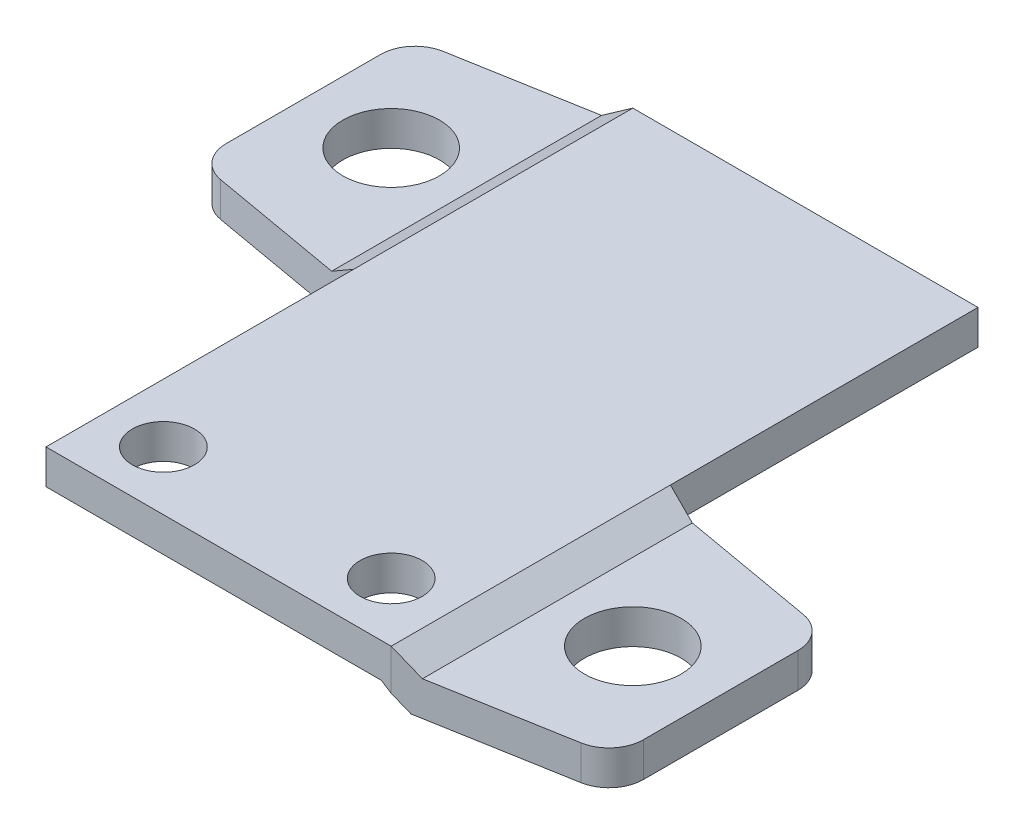
ISO-10303-21;
HEADER;
FILE_DESCRIPTION(('STEP AP214'),'2;1');
FILE_NAME('part.step','',(''),(''),'','','');
FILE_SCHEMA(('AUTOMOTIVE_DESIGN { 1 0 10303 214 1 1 1 1 }'));
ENDSEC;
DATA;
#1=APPLICATION_CONTEXT('core data for automotive mechanical design processes');
#2=APPLICATION_PROTOCOL_DEFINITION('international standard','automotive_design',2000,#1);
#3=PRODUCT_CONTEXT('',#1,'mechanical');
#4=PRODUCT('Part','Part','',(#3));
#5=PRODUCT_RELATED_PRODUCT_CATEGORY('part','',(#4));
#6=PRODUCT_DEFINITION_FORMATION('','',#4);
#7=PRODUCT_DEFINITION_CONTEXT('part definition',#1,'design');
#8=PRODUCT_DEFINITION('design','',#6,#7);
#9=PRODUCT_DEFINITION_SHAPE('','',#8);
#10=(LENGTH_UNIT() NAMED_UNIT(*) SI_UNIT(.MILLI.,.METRE.));
#11=(NAMED_UNIT(*) PLANE_ANGLE_UNIT() SI_UNIT($,.RADIAN.));
#12=(NAMED_UNIT(*) SI_UNIT($,.STERADIAN.) SOLID_ANGLE_UNIT());
#13=UNCERTAINTY_MEASURE_WITH_UNIT(LENGTH_MEASURE(1.E-05),#10,'distance_accuracy_value','');
#14=(GEOMETRIC_REPRESENTATION_CONTEXT(3) GLOBAL_UNCERTAINTY_ASSIGNED_CONTEXT((#13)) GLOBAL_UNIT_ASSIGNED_CONTEXT((#10,
#11,#12)) REPRESENTATION_CONTEXT('',''));
#15=CARTESIAN_POINT('',(0.,0.,0.));
#16=DIRECTION('',(0.,0.,1.));
#17=DIRECTION('',(1.,0.,0.));
#18=AXIS2_PLACEMENT_3D('',#15,#16,#17);
#19=CARTESIAN_POINT('',(-5.76993248190729,-0.5,8.5));
#20=DIRECTION('',(0.544639035015029,-0.838670567945423,0.));
#21=DIRECTION('',(0.838670567945423,0.544639035015029,0.));
#22=AXIS2_PLACEMENT_3D('',#19,#20,#21);
#23=PLANE('',#22);
#24=DIRECTION('',(0.,0.,-1.));
#25=VECTOR('',#24,1.);
#26=CARTESIAN_POINT('',(-5.76993248190729,-0.5,8.5));
#27=LINE('',#26,#25);
#28=CARTESIAN_POINT('',(-5.76993248190729,-0.5,-0.545961475987513));
#29=VERTEX_POINT('',#28);
#30=CARTESIAN_POINT('',(-5.76993248190729,-0.5,-8.36424013011591));
#31=VERTEX_POINT('',#30);
#32=EDGE_CURVE('E218',#29,#31,#27,.T.);
#33=ORIENTED_EDGE('',*,*,#32,.F.);
#34=DIRECTION('',(0.829648021602656,0.53877972491006,0.146289330699951));
#35=VECTOR('',#34,1.);
#36=CARTESIAN_POINT('',(-4.67203631526905,0.212982107157314,-0.352372759792788));
#37=LINE('',#36,#35);
#38=CARTESIAN_POINT('',(-5.,0.,-0.410201606103421));
#39=VERTEX_POINT('',#38);
#40=EDGE_CURVE('E287',#29,#39,#37,.T.);
#41=ORIENTED_EDGE('',*,*,#40,.T.);
#42=DIRECTION('',(0.,0.,-1.));
#43=VECTOR('',#42,1.);
#44=CARTESIAN_POINT('',(-5.,0.,8.5));
#45=LINE('',#44,#43);
#46=CARTESIAN_POINT('',(-5.,0.,-8.5));
#47=VERTEX_POINT('',#46);
#48=EDGE_CURVE('E348',#39,#47,#45,.T.);
#49=ORIENTED_EDGE('',*,*,#48,.T.);
#50=DIRECTION('',(-0.829648021602656,-0.53877972491006,0.146289330699951));
#51=VECTOR('',#50,1.);
#52=CARTESIAN_POINT('',(-7.81672260380528,-1.82920104684222,-8.00333580777771));
#53=LINE('',#52,#51);
#54=EDGE_CURVE('E301',#47,#31,#53,.T.);
#55=ORIENTED_EDGE('',*,*,#54,.T.);
#56=EDGE_LOOP('',(#33,#41,#49,#55));
#57=FACE_BOUND('',#56,.T.);
#58=ADVANCED_FACE('F40',(#57),#23,.F.);
#59=CARTESIAN_POINT('',(-10.5,-0.5,8.5));
#60=DIRECTION('',(0.,-1.,0.));
#61=DIRECTION('',(0.,0.,-1.));
#62=AXIS2_PLACEMENT_3D('',#59,#60,#61);
#63=PLANE('',#62);
#64=CARTESIAN_POINT('',(-8.,-0.5,-4.5));
#65=DIRECTION('',(0.,-1.,0.));
#66=DIRECTION('',(0.,0.,-1.));
#67=AXIS2_PLACEMENT_3D('',#64,#65,#66);
#68=CIRCLE('',#67,1.4);
#69=CARTESIAN_POINT('',(-8.,-0.5,-5.9));
#70=VERTEX_POINT('',#69);
#71=EDGE_CURVE('E326',#70,#70,#68,.T.);
#72=ORIENTED_EDGE('',*,*,#71,.T.);
#73=EDGE_LOOP('',(#72));
#74=FACE_BOUND('',#73,.T.);
#75=DIRECTION('',(0.,0.,-1.));
#76=VECTOR('',#75,1.);
#77=CARTESIAN_POINT('',(-10.5,-0.5,8.5));
#78=LINE('',#77,#76);
#79=CARTESIAN_POINT('',(-10.5,-0.5,-2.21909963117728));
#80=VERTEX_POINT('',#79);
#81=CARTESIAN_POINT('',(-10.5,-0.5,-6.69110197492614));
#82=VERTEX_POINT('',#81);
#83=EDGE_CURVE('E216',#80,#82,#78,.T.);
#84=ORIENTED_EDGE('',*,*,#83,.F.);
#85=CARTESIAN_POINT('',(-9.5,-0.5,-2.21909963117728));
#86=DIRECTION('',(0.,-1.,0.));
#87=DIRECTION('',(0.,0.,-1.));
#88=AXIS2_PLACEMENT_3D('',#85,#86,#87);
#89=CIRCLE('',#88,1.);
#90=CARTESIAN_POINT('',(-9.67364817766694,-0.5,-1.23429187816507));
#91=VERTEX_POINT('',#90);
#92=EDGE_CURVE('E270',#80,#91,#89,.F.);
#93=ORIENTED_EDGE('',*,*,#92,.T.);
#94=DIRECTION('',(0.984807753012207,0.,0.173648177666934));
#95=VECTOR('',#94,1.);
#96=CARTESIAN_POINT('',(-8.81042049197116,-0.5,-1.08208154668238));
#97=LINE('',#96,#95);
#98=EDGE_CURVE('E283',#91,#29,#97,.T.);
#99=ORIENTED_EDGE('',*,*,#98,.T.);
#100=ORIENTED_EDGE('',*,*,#32,.T.);
#101=DIRECTION('',(-0.984807753012207,0.,0.173648177666935));
#102=VECTOR('',#101,1.);
#103=CARTESIAN_POINT('',(-13.2413259254295,-0.5,-7.04683188253458));
#104=LINE('',#103,#102);
#105=CARTESIAN_POINT('',(-9.67364817766694,-0.5,-7.67590972793835));
#106=VERTEX_POINT('',#105);
#107=EDGE_CURVE('E302',#31,#106,#104,.T.);
#108=ORIENTED_EDGE('',*,*,#107,.T.);
#109=CARTESIAN_POINT('',(-9.5,-0.5,-6.69110197492614));
#110=DIRECTION('',(0.,-1.,0.));
#111=DIRECTION('',(0.,0.,-1.));
#112=AXIS2_PLACEMENT_3D('',#109,#110,#111);
#113=CIRCLE('',#112,1.);
#114=EDGE_CURVE('E264',#106,#82,#113,.F.);
#115=ORIENTED_EDGE('',*,*,#114,.T.);
#116=EDGE_LOOP('',(#84,#93,#99,#100,#108,#115));
#117=FACE_BOUND('',#116,.T.);
#118=ADVANCED_FACE('F284',(#74,#117),#63,.F.);
#119=CARTESIAN_POINT('',(-10.5,-1.5,8.5));
#120=DIRECTION('',(1.,0.,0.));
#121=DIRECTION('',(0.,0.,-1.));
#122=AXIS2_PLACEMENT_3D('',#119,#120,#121);
#123=PLANE('',#122);
#124=DIRECTION('',(0.,0.,-1.));
#125=VECTOR('',#124,1.);
#126=CARTESIAN_POINT('',(-10.5,-1.5,8.5));
#127=LINE('',#126,#125);
#128=CARTESIAN_POINT('',(-10.5,-1.5,-2.21909963117728));
#129=VERTEX_POINT('',#128);
#130=CARTESIAN_POINT('',(-10.5,-1.5,-6.69110197492614));
#131=VERTEX_POINT('',#130);
#132=EDGE_CURVE('E212',#129,#131,#127,.T.);
#133=ORIENTED_EDGE('',*,*,#132,.F.);
#134=DIRECTION('',(0.,1.,0.));
#135=VECTOR('',#134,1.);
#136=CARTESIAN_POINT('',(-10.5,-1.5,-2.21909963117728));
#137=LINE('',#136,#135);
#138=EDGE_CURVE('E265',#129,#80,#137,.T.);
#139=ORIENTED_EDGE('',*,*,#138,.T.);
#140=ORIENTED_EDGE('',*,*,#83,.T.);
#141=DIRECTION('',(0.,1.,0.));
#142=VECTOR('',#141,1.);
#143=CARTESIAN_POINT('',(-10.5,-1.5,-6.69110197492614));
#144=LINE('',#143,#142);
#145=EDGE_CURVE('E257',#82,#131,#144,.F.);
#146=ORIENTED_EDGE('',*,*,#145,.T.);
#147=EDGE_LOOP('',(#133,#139,#140,#146));
#148=FACE_BOUND('',#147,.T.);
#149=ADVANCED_FACE('F279',(#148),#123,.F.);
#150=CARTESIAN_POINT('',(-5.487,-1.5,8.5));
#151=DIRECTION('',(0.,1.,0.));
#152=DIRECTION('',(-1.,0.,0.));
#153=AXIS2_PLACEMENT_3D('',#150,#151,#152);
#154=PLANE('',#153);
#155=CARTESIAN_POINT('',(-8.,-1.5,-4.5));
#156=DIRECTION('',(0.,1.,0.));
#157=DIRECTION('',(0.,0.,1.));
#158=AXIS2_PLACEMENT_3D('',#155,#156,#157);
#159=CIRCLE('',#158,1.4);
#160=CARTESIAN_POINT('',(-8.,-1.5,-3.1));
#161=VERTEX_POINT('',#160);
#162=EDGE_CURVE('E323',#161,#161,#159,.T.);
#163=ORIENTED_EDGE('',*,*,#162,.T.);
#164=EDGE_LOOP('',(#163));
#165=FACE_BOUND('',#164,.T.);
#166=DIRECTION('',(-0.984807753012207,0.,-0.173648177666934));
#167=VECTOR('',#166,1.);
#168=CARTESIAN_POINT('',(-10.5,-1.5,-1.38));
#169=LINE('',#168,#167);
#170=CARTESIAN_POINT('',(-5.487,-1.5,-0.496072845708446));
#171=VERTEX_POINT('',#170);
#172=CARTESIAN_POINT('',(-9.67364817766694,-1.5,-1.23429187816507));
#173=VERTEX_POINT('',#172);
#174=EDGE_CURVE('E273',#171,#173,#169,.T.);
#175=ORIENTED_EDGE('',*,*,#174,.T.);
#176=CARTESIAN_POINT('',(-9.5,-1.5,-2.21909963117728));
#177=DIRECTION('',(0.,1.,0.));
#178=DIRECTION('',(-1.,0.,0.));
#179=AXIS2_PLACEMENT_3D('',#176,#177,#178);
#180=CIRCLE('',#179,1.);
#181=EDGE_CURVE('E44',#173,#129,#180,.F.);
#182=ORIENTED_EDGE('',*,*,#181,.T.);
#183=ORIENTED_EDGE('',*,*,#132,.T.);
#184=CARTESIAN_POINT('',(-9.5,-1.5,-6.69110197492614));
#185=DIRECTION('',(0.,1.,0.));
#186=DIRECTION('',(-1.,0.,0.));
#187=AXIS2_PLACEMENT_3D('',#184,#185,#186);
#188=CIRCLE('',#187,1.);
#189=CARTESIAN_POINT('',(-9.67364817766694,-1.5,-7.67590972793835));
#190=VERTEX_POINT('',#189);
#191=EDGE_CURVE('E55',#131,#190,#188,.F.);
#192=ORIENTED_EDGE('',*,*,#191,.T.);
#193=DIRECTION('',(0.984807753012207,0.,-0.173648177666935));
#194=VECTOR('',#193,1.);
#195=CARTESIAN_POINT('',(-5.,-1.5,-8.5));
#196=LINE('',#195,#194);
#197=CARTESIAN_POINT('',(-5.487,-1.5,-8.41412876039498));
#198=VERTEX_POINT('',#197);
#199=EDGE_CURVE('E295',#190,#198,#196,.T.);
#200=ORIENTED_EDGE('',*,*,#199,.T.);
#201=DIRECTION('',(0.,0.,-1.));
#202=VECTOR('',#201,1.);
#203=CARTESIAN_POINT('',(-5.487,-1.5,8.5));
#204=LINE('',#203,#202);
#205=EDGE_CURVE('E206',#171,#198,#204,.T.);
#206=ORIENTED_EDGE('',*,*,#205,.F.);
#207=EDGE_LOOP('',(#175,#182,#183,#192,#200,#206));
#208=FACE_BOUND('',#207,.T.);
#209=ADVANCED_FACE('F275',(#165,#208),#154,.F.);
#210=CARTESIAN_POINT('',(-4.71706751809271,-1.,8.5));
#211=DIRECTION('',(-0.544639035015029,0.838670567945423,0.));
#212=DIRECTION('',(-0.838670567945423,-0.544639035015029,0.));
#213=AXIS2_PLACEMENT_3D('',#210,#211,#212);
#214=PLANE('',#213);
#215=DIRECTION('',(0.,0.,-1.));
#216=VECTOR('',#215,1.);
#217=CARTESIAN_POINT('',(-4.71706751809271,-1.,8.5));
#218=LINE('',#217,#216);
#219=CARTESIAN_POINT('',(-4.71706751809271,-1.,-0.360312975824356));
#220=VERTEX_POINT('',#219);
#221=CARTESIAN_POINT('',(-4.71706751809271,-1.,-8.5));
#222=VERTEX_POINT('',#221);
#223=EDGE_CURVE('E201',#220,#222,#218,.T.);
#224=ORIENTED_EDGE('',*,*,#223,.F.);
#225=DIRECTION('',(-0.829648021602656,-0.53877972491006,-0.146289330699951));
#226=VECTOR('',#225,1.);
#227=CARTESIAN_POINT('',(-3.64170325999867,-0.30165028534052,-0.170697243032831));
#228=LINE('',#227,#226);
#229=EDGE_CURVE('E239',#220,#171,#228,.T.);
#230=ORIENTED_EDGE('',*,*,#229,.T.);
#231=ORIENTED_EDGE('',*,*,#205,.T.);
#232=DIRECTION('',(0.829648021602656,0.53877972491006,-0.146289330699951));
#233=VECTOR('',#232,1.);
#234=CARTESIAN_POINT('',(-6.7863895485349,-2.34383343934006,-8.18501132453767));
#235=LINE('',#234,#233);
#236=CARTESIAN_POINT('',(-5.,-1.18373850211281,-8.5));
#237=VERTEX_POINT('',#236);
#238=EDGE_CURVE('E297',#198,#237,#235,.T.);
#239=ORIENTED_EDGE('',*,*,#238,.T.);
#240=DIRECTION('',(0.838670567945423,0.544639035015029,0.));
#241=VECTOR('',#240,1.);
#242=CARTESIAN_POINT('',(-4.71706751809271,-1.,-8.5));
#243=LINE('',#242,#241);
#244=EDGE_CURVE('E345',#237,#222,#243,.T.);
#245=ORIENTED_EDGE('',*,*,#244,.T.);
#246=EDGE_LOOP('',(#224,#230,#231,#239,#245));
#247=FACE_BOUND('',#246,.T.);
#248=ADVANCED_FACE('F522',(#247),#214,.F.);
#249=CARTESIAN_POINT('',(4.71706751809271,-1.,8.5));
#250=DIRECTION('',(0.,1.,0.));
#251=DIRECTION('',(0.,0.,1.));
#252=AXIS2_PLACEMENT_3D('',#249,#250,#251);
#253=PLANE('',#252);
#254=CARTESIAN_POINT('',(3.3,-1.,6.8));
#255=DIRECTION('',(0.,1.,0.));
#256=DIRECTION('',(0.,0.,1.));
#257=AXIS2_PLACEMENT_3D('',#254,#255,#256);
#258=CIRCLE('',#257,0.899999999999999);
#259=CARTESIAN_POINT('',(3.3,-1.,7.7));
#260=VERTEX_POINT('',#259);
#261=EDGE_CURVE('E334',#260,#260,#258,.T.);
#262=ORIENTED_EDGE('',*,*,#261,.T.);
#263=EDGE_LOOP('',(#262));
#264=FACE_BOUND('',#263,.T.);
#265=CARTESIAN_POINT('',(-3.3,-1.,6.8));
#266=DIRECTION('',(0.,1.,0.));
#267=DIRECTION('',(0.,0.,1.));
#268=AXIS2_PLACEMENT_3D('',#265,#266,#267);
#269=CIRCLE('',#268,0.9);
#270=CARTESIAN_POINT('',(-3.3,-1.,7.7));
#271=VERTEX_POINT('',#270);
#272=EDGE_CURVE('E338',#271,#271,#269,.T.);
#273=ORIENTED_EDGE('',*,*,#272,.T.);
#274=EDGE_LOOP('',(#273));
#275=FACE_BOUND('',#274,.T.);
#276=DIRECTION('',(1.,0.,0.));
#277=VECTOR('',#276,1.);
#278=CARTESIAN_POINT('',(4.71706751809271,-1.,-8.5));
#279=LINE('',#278,#277);
#280=CARTESIAN_POINT('',(5.,-1.,-8.5));
#281=VERTEX_POINT('',#280);
#282=EDGE_CURVE('E352',#222,#281,#279,.T.);
#283=ORIENTED_EDGE('',*,*,#282,.T.);
#284=DIRECTION('',(0.,0.,-1.));
#285=VECTOR('',#284,1.);
#286=CARTESIAN_POINT('',(5.,-1.,0.72521774456594));
#287=LINE('',#286,#285);
#288=CARTESIAN_POINT('',(5.,-1.,0.410201606103422));
#289=VERTEX_POINT('',#288);
#290=EDGE_CURVE('E197',#289,#281,#287,.T.);
#291=ORIENTED_EDGE('',*,*,#290,.F.);
#292=DIRECTION('',(0.984807753012207,0.,0.173648177666934));
#293=VECTOR('',#292,1.);
#294=CARTESIAN_POINT('',(4.77946990874532,-1.,0.371316200957121));
#295=LINE('',#294,#293);
#296=CARTESIAN_POINT('',(4.71706751809271,-1.,0.360312975824356));
#297=VERTEX_POINT('',#296);
#298=EDGE_CURVE('E179',#297,#289,#295,.T.);
#299=ORIENTED_EDGE('',*,*,#298,.F.);
#300=DIRECTION('',(0.,0.,-1.));
#301=VECTOR('',#300,1.);
#302=CARTESIAN_POINT('',(4.71706751809271,-1.,8.5));
#303=LINE('',#302,#301);
#304=CARTESIAN_POINT('',(4.71706751809271,-1.,8.5));
#305=VERTEX_POINT('',#304);
#306=EDGE_CURVE('E191',#305,#297,#303,.T.);
#307=ORIENTED_EDGE('',*,*,#306,.F.);
#308=DIRECTION('',(1.,0.,0.));
#309=VECTOR('',#308,1.);
#310=CARTESIAN_POINT('',(4.71706751809271,-1.,8.5));
#311=LINE('',#310,#309);
#312=CARTESIAN_POINT('',(-5.,-1.,8.5));
#313=VERTEX_POINT('',#312);
#314=EDGE_CURVE('E342',#313,#305,#311,.T.);
#315=ORIENTED_EDGE('',*,*,#314,.F.);
#316=DIRECTION('',(0.,0.,1.));
#317=VECTOR('',#316,1.);
#318=CARTESIAN_POINT('',(-5.,-1.,-0.725217744565933));
#319=LINE('',#318,#317);
#320=CARTESIAN_POINT('',(-5.,-1.,-0.410201606103421));
#321=VERTEX_POINT('',#320);
#322=EDGE_CURVE('E399',#321,#313,#319,.T.);
#323=ORIENTED_EDGE('',*,*,#322,.F.);
#324=DIRECTION('',(-0.984807753012207,0.,-0.173648177666934));
#325=VECTOR('',#324,1.);
#326=CARTESIAN_POINT('',(-4.77946990874532,-1.,-0.371316200957121));
#327=LINE('',#326,#325);
#328=EDGE_CURVE('E403',#220,#321,#327,.T.);
#329=ORIENTED_EDGE('',*,*,#328,.F.);
#330=ORIENTED_EDGE('',*,*,#223,.T.);
#331=EDGE_LOOP('',(#283,#291,#299,#307,#315,#323,#329,#330));
#332=FACE_BOUND('',#331,.T.);
#333=ADVANCED_FACE('F195',(#264,#275,#332),#253,.F.);
#334=CARTESIAN_POINT('',(5.487,-1.5,8.5));
#335=DIRECTION('',(0.544639035015029,0.838670567945423,0.));
#336=DIRECTION('',(-0.838670567945423,0.544639035015029,0.));
#337=AXIS2_PLACEMENT_3D('',#334,#335,#336);
#338=PLANE('',#337);
#339=ORIENTED_EDGE('',*,*,#306,.T.);
#340=DIRECTION('',(0.829648021602656,-0.538779724910059,0.146289330699951));
#341=VECTOR('',#340,1.);
#342=CARTESIAN_POINT('',(6.45842586380395,-2.13085133218274,0.667361435255113));
#343=LINE('',#342,#341);
#344=CARTESIAN_POINT('',(5.487,-1.5,0.496072845708446));
#345=VERTEX_POINT('',#344);
#346=EDGE_CURVE('E176',#297,#345,#343,.T.);
#347=ORIENTED_EDGE('',*,*,#346,.T.);
#348=DIRECTION('',(0.,0.,-1.));
#349=VECTOR('',#348,1.);
#350=CARTESIAN_POINT('',(5.487,-1.5,8.5));
#351=LINE('',#350,#349);
#352=CARTESIAN_POINT('',(5.487,-1.5,8.41412876039498));
#353=VERTEX_POINT('',#352);
#354=EDGE_CURVE('E204',#353,#345,#351,.T.);
#355=ORIENTED_EDGE('',*,*,#354,.F.);
#356=DIRECTION('',(-0.829648021602656,0.538779724910059,0.146289330699952));
#357=VECTOR('',#356,1.);
#358=CARTESIAN_POINT('',(5.47657792324928,-1.49323182422119,8.41596645372114));
#359=LINE('',#358,#357);
#360=CARTESIAN_POINT('',(5.,-1.18373850211281,8.5));
#361=VERTEX_POINT('',#360);
#362=EDGE_CURVE('E321',#353,#361,#359,.T.);
#363=ORIENTED_EDGE('',*,*,#362,.T.);
#364=DIRECTION('',(0.838670567945423,-0.544639035015029,0.));
#365=VECTOR('',#364,1.);
#366=CARTESIAN_POINT('',(5.487,-1.5,8.5));
#367=LINE('',#366,#365);
#368=EDGE_CURVE('E205',#305,#361,#367,.T.);
#369=ORIENTED_EDGE('',*,*,#368,.F.);
#370=EDGE_LOOP('',(#339,#347,#355,#363,#369));
#371=FACE_BOUND('',#370,.T.);
#372=ADVANCED_FACE('F200',(#371),#338,.F.);
#373=CARTESIAN_POINT('',(10.5,-1.5,8.5));
#374=DIRECTION('',(0.,1.,0.));
#375=DIRECTION('',(-1.,0.,0.));
#376=AXIS2_PLACEMENT_3D('',#373,#374,#375);
#377=PLANE('',#376);
#378=CARTESIAN_POINT('',(8.,-1.5,4.5));
#379=DIRECTION('',(0.,1.,0.));
#380=DIRECTION('',(0.,0.,1.));
#381=AXIS2_PLACEMENT_3D('',#378,#379,#380);
#382=CIRCLE('',#381,1.4);
#383=CARTESIAN_POINT('',(8.,-1.5,5.9));
#384=VERTEX_POINT('',#383);
#385=EDGE_CURVE('E226',#384,#384,#382,.T.);
#386=ORIENTED_EDGE('',*,*,#385,.T.);
#387=EDGE_LOOP('',(#386));
#388=FACE_BOUND('',#387,.T.);
#389=DIRECTION('',(0.,0.,-1.));
#390=VECTOR('',#389,1.);
#391=CARTESIAN_POINT('',(10.5,-1.5,8.5));
#392=LINE('',#391,#390);
#393=CARTESIAN_POINT('',(10.5,-1.5,6.69110197492614));
#394=VERTEX_POINT('',#393);
#395=CARTESIAN_POINT('',(10.5,-1.5,2.21909963117728));
#396=VERTEX_POINT('',#395);
#397=EDGE_CURVE('E208',#394,#396,#392,.T.);
#398=ORIENTED_EDGE('',*,*,#397,.F.);
#399=CARTESIAN_POINT('',(9.5,-1.5,6.69110197492614));
#400=DIRECTION('',(0.,1.,0.));
#401=DIRECTION('',(-1.,0.,0.));
#402=AXIS2_PLACEMENT_3D('',#399,#400,#401);
#403=CIRCLE('',#402,1.);
#404=CARTESIAN_POINT('',(9.67364817766694,-1.5,7.67590972793835));
#405=VERTEX_POINT('',#404);
#406=EDGE_CURVE('E258',#394,#405,#403,.F.);
#407=ORIENTED_EDGE('',*,*,#406,.T.);
#408=DIRECTION('',(-0.984807753012207,0.,0.173648177666935));
#409=VECTOR('',#408,1.);
#410=CARTESIAN_POINT('',(5.,-1.5,8.5));
#411=LINE('',#410,#409);
#412=EDGE_CURVE('E187',#405,#353,#411,.T.);
#413=ORIENTED_EDGE('',*,*,#412,.T.);
#414=ORIENTED_EDGE('',*,*,#354,.T.);
#415=DIRECTION('',(0.984807753012207,0.,0.173648177666934));
#416=VECTOR('',#415,1.);
#417=CARTESIAN_POINT('',(10.5,-1.5,1.38));
#418=LINE('',#417,#416);
#419=CARTESIAN_POINT('',(9.67364817766694,-1.5,1.23429187816507));
#420=VERTEX_POINT('',#419);
#421=EDGE_CURVE('E181',#345,#420,#418,.T.);
#422=ORIENTED_EDGE('',*,*,#421,.T.);
#423=CARTESIAN_POINT('',(9.5,-1.5,2.21909963117728));
#424=DIRECTION('',(0.,1.,0.));
#425=DIRECTION('',(-1.,0.,0.));
#426=AXIS2_PLACEMENT_3D('',#423,#424,#425);
#427=CIRCLE('',#426,1.);
#428=EDGE_CURVE('E255',#420,#396,#427,.F.);
#429=ORIENTED_EDGE('',*,*,#428,.T.);
#430=EDGE_LOOP('',(#398,#407,#413,#414,#422,#429));
#431=FACE_BOUND('',#430,.T.);
#432=ADVANCED_FACE('F395',(#388,#431),#377,.F.);
#433=CARTESIAN_POINT('',(10.5,-0.5,8.5));
#434=DIRECTION('',(-1.,0.,0.));
#435=DIRECTION('',(0.,0.,1.));
#436=AXIS2_PLACEMENT_3D('',#433,#434,#435);
#437=PLANE('',#436);
#438=DIRECTION('',(0.,0.,-1.));
#439=VECTOR('',#438,1.);
#440=CARTESIAN_POINT('',(10.5,-0.5,8.5));
#441=LINE('',#440,#439);
#442=CARTESIAN_POINT('',(10.5,-0.5,6.69110197492614));
#443=VERTEX_POINT('',#442);
#444=CARTESIAN_POINT('',(10.5,-0.5,2.21909963117728));
#445=VERTEX_POINT('',#444);
#446=EDGE_CURVE('E368',#443,#445,#441,.T.);
#447=ORIENTED_EDGE('',*,*,#446,.F.);
#448=DIRECTION('',(0.,1.,0.));
#449=VECTOR('',#448,1.);
#450=CARTESIAN_POINT('',(10.5,-0.5,6.69110197492614));
#451=LINE('',#450,#449);
#452=EDGE_CURVE('E252',#443,#394,#451,.F.);
#453=ORIENTED_EDGE('',*,*,#452,.T.);
#454=ORIENTED_EDGE('',*,*,#397,.T.);
#455=DIRECTION('',(0.,1.,0.));
#456=VECTOR('',#455,1.);
#457=CARTESIAN_POINT('',(10.5,-0.5,2.21909963117728));
#458=LINE('',#457,#456);
#459=EDGE_CURVE('E246',#396,#445,#458,.T.);
#460=ORIENTED_EDGE('',*,*,#459,.T.);
#461=EDGE_LOOP('',(#447,#453,#454,#460));
#462=FACE_BOUND('',#461,.T.);
#463=ADVANCED_FACE('F373',(#462),#437,.F.);
#464=CARTESIAN_POINT('',(5.76993248190729,-0.5,8.5));
#465=DIRECTION('',(0.,-1.,0.));
#466=DIRECTION('',(0.,0.,-1.));
#467=AXIS2_PLACEMENT_3D('',#464,#465,#466);
#468=PLANE('',#467);
#469=CARTESIAN_POINT('',(8.,-0.5,4.5));
#470=DIRECTION('',(0.,-1.,0.));
#471=DIRECTION('',(0.,0.,-1.));
#472=AXIS2_PLACEMENT_3D('',#469,#470,#471);
#473=CIRCLE('',#472,1.4);
#474=CARTESIAN_POINT('',(8.,-0.5,3.1));
#475=VERTEX_POINT('',#474);
#476=EDGE_CURVE('E225',#475,#475,#473,.T.);
#477=ORIENTED_EDGE('',*,*,#476,.T.);
#478=EDGE_LOOP('',(#477));
#479=FACE_BOUND('',#478,.T.);
#480=DIRECTION('',(0.984807753012207,0.,-0.173648177666935));
#481=VECTOR('',#480,1.);
#482=CARTESIAN_POINT('',(5.74671617682947,-0.5,8.36833379109349));
#483=LINE('',#482,#481);
#484=CARTESIAN_POINT('',(5.76993248190729,-0.5,8.36424013011591));
#485=VERTEX_POINT('',#484);
#486=CARTESIAN_POINT('',(9.67364817766694,-0.5,7.67590972793835));
#487=VERTEX_POINT('',#486);
#488=EDGE_CURVE('E318',#485,#487,#483,.T.);
#489=ORIENTED_EDGE('',*,*,#488,.T.);
#490=CARTESIAN_POINT('',(9.5,-0.5,6.69110197492614));
#491=DIRECTION('',(0.,-1.,0.));
#492=DIRECTION('',(0.,0.,-1.));
#493=AXIS2_PLACEMENT_3D('',#490,#491,#492);
#494=CIRCLE('',#493,1.);
#495=EDGE_CURVE('E249',#487,#443,#494,.F.);
#496=ORIENTED_EDGE('',*,*,#495,.T.);
#497=ORIENTED_EDGE('',*,*,#446,.T.);
#498=CARTESIAN_POINT('',(9.5,-0.5,2.21909963117728));
#499=DIRECTION('',(0.,-1.,0.));
#500=DIRECTION('',(0.,0.,-1.));
#501=AXIS2_PLACEMENT_3D('',#498,#499,#500);
#502=CIRCLE('',#501,1.);
#503=CARTESIAN_POINT('',(9.67364817766694,-0.5,1.23429187816507));
#504=VERTEX_POINT('',#503);
#505=EDGE_CURVE('E244',#445,#504,#502,.F.);
#506=ORIENTED_EDGE('',*,*,#505,.T.);
#507=DIRECTION('',(-0.984807753012207,0.,-0.173648177666934));
#508=VECTOR('',#507,1.);
#509=CARTESIAN_POINT('',(7.13015317990764,-0.5,0.785805084763081));
#510=LINE('',#509,#508);
#511=CARTESIAN_POINT('',(5.76993248190729,-0.5,0.545961475987512));
#512=VERTEX_POINT('',#511);
#513=EDGE_CURVE('E188',#504,#512,#510,.T.);
#514=ORIENTED_EDGE('',*,*,#513,.T.);
#515=DIRECTION('',(0.,0.,-1.));
#516=VECTOR('',#515,1.);
#517=CARTESIAN_POINT('',(5.76993248190729,-0.5,8.5));
#518=LINE('',#517,#516);
#519=EDGE_CURVE('E361',#485,#512,#518,.T.);
#520=ORIENTED_EDGE('',*,*,#519,.F.);
#521=EDGE_LOOP('',(#489,#496,#497,#506,#514,#520));
#522=FACE_BOUND('',#521,.T.);
#523=ADVANCED_FACE('F385',(#479,#522),#468,.F.);
#524=CARTESIAN_POINT('',(5.,0.,8.5));
#525=DIRECTION('',(-0.544639035015029,-0.838670567945423,0.));
#526=DIRECTION('',(0.838670567945423,-0.544639035015029,0.));
#527=AXIS2_PLACEMENT_3D('',#524,#525,#526);
#528=PLANE('',#527);
#529=ORIENTED_EDGE('',*,*,#519,.T.);
#530=DIRECTION('',(-0.829648021602656,0.538779724910059,-0.146289330699951));
#531=VECTOR('',#530,1.);
#532=CARTESIAN_POINT('',(5.98184794055467,-0.637619507961543,0.583327888976255));
#533=LINE('',#532,#531);
#534=CARTESIAN_POINT('',(5.,0.,0.410201606103422));
#535=VERTEX_POINT('',#534);
#536=EDGE_CURVE('E231',#512,#535,#533,.T.);
#537=ORIENTED_EDGE('',*,*,#536,.T.);
#538=DIRECTION('',(0.,0.,-1.));
#539=VECTOR('',#538,1.);
#540=CARTESIAN_POINT('',(5.,0.,8.5));
#541=LINE('',#540,#539);
#542=CARTESIAN_POINT('',(5.,0.,8.5));
#543=VERTEX_POINT('',#542);
#544=EDGE_CURVE('E358',#543,#535,#541,.T.);
#545=ORIENTED_EDGE('',*,*,#544,.F.);
#546=DIRECTION('',(0.829648021602656,-0.538779724910059,-0.146289330699952));
#547=VECTOR('',#546,1.);
#548=CARTESIAN_POINT('',(5.,0.,8.5));
#549=LINE('',#548,#547);
#550=EDGE_CURVE('E312',#543,#485,#549,.T.);
#551=ORIENTED_EDGE('',*,*,#550,.T.);
#552=EDGE_LOOP('',(#529,#537,#545,#551));
#553=FACE_BOUND('',#552,.T.);
#554=ADVANCED_FACE('F390',(#553),#528,.F.);
#555=CARTESIAN_POINT('',(-5.,0.,8.5));
#556=DIRECTION('',(0.,-1.,0.));
#557=DIRECTION('',(0.,0.,-1.));
#558=AXIS2_PLACEMENT_3D('',#555,#556,#557);
#559=PLANE('',#558);
#560=CARTESIAN_POINT('',(3.3,0.,6.8));
#561=DIRECTION('',(0.,1.,0.));
#562=DIRECTION('',(0.,0.,1.));
#563=AXIS2_PLACEMENT_3D('',#560,#561,#562);
#564=CIRCLE('',#563,0.899999999999999);
#565=CARTESIAN_POINT('',(3.3,0.,7.7));
#566=VERTEX_POINT('',#565);
#567=EDGE_CURVE('E223',#566,#566,#564,.T.);
#568=ORIENTED_EDGE('',*,*,#567,.F.);
#569=EDGE_LOOP('',(#568));
#570=FACE_BOUND('',#569,.T.);
#571=CARTESIAN_POINT('',(-3.3,0.,6.8));
#572=DIRECTION('',(0.,1.,0.));
#573=DIRECTION('',(0.,0.,1.));
#574=AXIS2_PLACEMENT_3D('',#571,#572,#573);
#575=CIRCLE('',#574,0.9);
#576=CARTESIAN_POINT('',(-3.3,0.,7.7));
#577=VERTEX_POINT('',#576);
#578=EDGE_CURVE('E336',#577,#577,#575,.T.);
#579=ORIENTED_EDGE('',*,*,#578,.F.);
#580=EDGE_LOOP('',(#579));
#581=FACE_BOUND('',#580,.T.);
#582=DIRECTION('',(-1.,0.,0.));
#583=VECTOR('',#582,1.);
#584=CARTESIAN_POINT('',(-5.,0.,-8.5));
#585=LINE('',#584,#583);
#586=CARTESIAN_POINT('',(5.,0.,-8.5));
#587=VERTEX_POINT('',#586);
#588=EDGE_CURVE('E344',#587,#47,#585,.T.);
#589=ORIENTED_EDGE('',*,*,#588,.T.);
#590=ORIENTED_EDGE('',*,*,#48,.F.);
#591=CARTESIAN_POINT('',(-5.,0.,8.5));
#592=VERTEX_POINT('',#591);
#593=EDGE_CURVE('E359',#592,#39,#45,.T.);
#594=ORIENTED_EDGE('',*,*,#593,.F.);
#595=DIRECTION('',(-1.,0.,0.));
#596=VECTOR('',#595,1.);
#597=CARTESIAN_POINT('',(-5.,0.,8.5));
#598=LINE('',#597,#596);
#599=EDGE_CURVE('E350',#543,#592,#598,.T.);
#600=ORIENTED_EDGE('',*,*,#599,.F.);
#601=ORIENTED_EDGE('',*,*,#544,.T.);
#602=DIRECTION('',(0.,0.,1.));
#603=VECTOR('',#602,1.);
#604=CARTESIAN_POINT('',(5.,0.,0.410201606103422));
#605=LINE('',#604,#603);
#606=EDGE_CURVE('E307',#587,#535,#605,.T.);
#607=ORIENTED_EDGE('',*,*,#606,.F.);
#608=EDGE_LOOP('',(#589,#590,#594,#600,#601,#607));
#609=FACE_BOUND('',#608,.T.);
#610=ADVANCED_FACE('F423',(#570,#581,#609),#559,.F.);
#611=CARTESIAN_POINT('',(0.,0.,8.5));
#612=DIRECTION('',(0.,0.,-1.));
#613=DIRECTION('',(-1.,0.,0.));
#614=AXIS2_PLACEMENT_3D('',#611,#612,#613);
#615=PLANE('',#614);
#616=DIRECTION('',(0.,-1.,0.));
#617=VECTOR('',#616,1.);
#618=CARTESIAN_POINT('',(-5.,0.,8.5));
#619=LINE('',#618,#617);
#620=EDGE_CURVE('E237',#592,#313,#619,.T.);
#621=ORIENTED_EDGE('',*,*,#620,.T.);
#622=ORIENTED_EDGE('',*,*,#314,.T.);
#623=ORIENTED_EDGE('',*,*,#368,.T.);
#624=DIRECTION('',(0.,1.,0.));
#625=VECTOR('',#624,1.);
#626=CARTESIAN_POINT('',(5.,0.,8.5));
#627=LINE('',#626,#625);
#628=EDGE_CURVE('E222',#361,#543,#627,.T.);
#629=ORIENTED_EDGE('',*,*,#628,.T.);
#630=ORIENTED_EDGE('',*,*,#599,.T.);
#631=EDGE_LOOP('',(#621,#622,#623,#629,#630));
#632=FACE_BOUND('',#631,.T.);
#633=ADVANCED_FACE('F400',(#632),#615,.F.);
#634=CARTESIAN_POINT('',(0.,0.,-8.5));
#635=DIRECTION('',(0.,0.,-1.));
#636=DIRECTION('',(-1.,0.,0.));
#637=AXIS2_PLACEMENT_3D('',#634,#635,#636);
#638=PLANE('',#637);
#639=DIRECTION('',(0.,1.,0.));
#640=VECTOR('',#639,1.);
#641=CARTESIAN_POINT('',(5.,0.,-8.5));
#642=LINE('',#641,#640);
#643=EDGE_CURVE('E228',#281,#587,#642,.T.);
#644=ORIENTED_EDGE('',*,*,#643,.F.);
#645=ORIENTED_EDGE('',*,*,#282,.F.);
#646=ORIENTED_EDGE('',*,*,#244,.F.);
#647=DIRECTION('',(0.,-1.,0.));
#648=VECTOR('',#647,1.);
#649=CARTESIAN_POINT('',(-5.,0.,-8.5));
#650=LINE('',#649,#648);
#651=EDGE_CURVE('E233',#47,#237,#650,.T.);
#652=ORIENTED_EDGE('',*,*,#651,.F.);
#653=ORIENTED_EDGE('',*,*,#588,.F.);
#654=EDGE_LOOP('',(#644,#645,#646,#652,#653));
#655=FACE_BOUND('',#654,.T.);
#656=ADVANCED_FACE('F418',(#655),#638,.T.);
#657=CARTESIAN_POINT('',(-3.3,-1.5,6.8));
#658=DIRECTION('',(0.,1.,0.));
#659=DIRECTION('',(0.,0.,1.));
#660=AXIS2_PLACEMENT_3D('',#657,#658,#659);
#661=CYLINDRICAL_SURFACE('',#660,0.9);
#662=ORIENTED_EDGE('',*,*,#578,.T.);
#663=EDGE_LOOP('',(#662));
#664=FACE_BOUND('',#663,.T.);
#665=ORIENTED_EDGE('',*,*,#272,.F.);
#666=EDGE_LOOP('',(#665));
#667=FACE_BOUND('',#666,.T.);
#668=ADVANCED_FACE('F542',(#664,#667),#661,.F.);
#669=CARTESIAN_POINT('',(3.3,-1.5,6.8));
#670=DIRECTION('',(0.,1.,0.));
#671=DIRECTION('',(0.,0.,1.));
#672=AXIS2_PLACEMENT_3D('',#669,#670,#671);
#673=CYLINDRICAL_SURFACE('',#672,0.899999999999999);
#674=ORIENTED_EDGE('',*,*,#567,.T.);
#675=EDGE_LOOP('',(#674));
#676=FACE_BOUND('',#675,.T.);
#677=ORIENTED_EDGE('',*,*,#261,.F.);
#678=EDGE_LOOP('',(#677));
#679=FACE_BOUND('',#678,.T.);
#680=ADVANCED_FACE('F595',(#676,#679),#673,.F.);
#681=CARTESIAN_POINT('',(8.,-1.5,4.5));
#682=DIRECTION('',(0.,1.,0.));
#683=DIRECTION('',(0.,0.,1.));
#684=AXIS2_PLACEMENT_3D('',#681,#682,#683);
#685=CYLINDRICAL_SURFACE('',#684,1.4);
#686=ORIENTED_EDGE('',*,*,#385,.F.);
#687=EDGE_LOOP('',(#686));
#688=FACE_BOUND('',#687,.T.);
#689=ORIENTED_EDGE('',*,*,#476,.F.);
#690=EDGE_LOOP('',(#689));
#691=FACE_BOUND('',#690,.T.);
#692=ADVANCED_FACE('F596',(#688,#691),#685,.F.);
#693=CARTESIAN_POINT('',(-8.,-1.5,-4.5));
#694=DIRECTION('',(0.,1.,0.));
#695=DIRECTION('',(0.,0.,1.));
#696=AXIS2_PLACEMENT_3D('',#693,#694,#695);
#697=CYLINDRICAL_SURFACE('',#696,1.4);
#698=ORIENTED_EDGE('',*,*,#162,.F.);
#699=EDGE_LOOP('',(#698));
#700=FACE_BOUND('',#699,.T.);
#701=ORIENTED_EDGE('',*,*,#71,.F.);
#702=EDGE_LOOP('',(#701));
#703=FACE_BOUND('',#702,.T.);
#704=ADVANCED_FACE('F491',(#700,#703),#697,.F.);
#705=CARTESIAN_POINT('',(5.,-1.5,8.5));
#706=DIRECTION('',(-0.173648177666935,0.,-0.984807753012207));
#707=DIRECTION('',(-0.984807753012207,0.,0.173648177666935));
#708=AXIS2_PLACEMENT_3D('',#705,#706,#707);
#709=PLANE('',#708);
#710=ORIENTED_EDGE('',*,*,#412,.F.);
#711=DIRECTION('',(0.,1.,0.));
#712=VECTOR('',#711,1.);
#713=CARTESIAN_POINT('',(9.67364817766694,-1.5,7.67590972793835));
#714=LINE('',#713,#712);
#715=EDGE_CURVE('E245',#405,#487,#714,.T.);
#716=ORIENTED_EDGE('',*,*,#715,.T.);
#717=ORIENTED_EDGE('',*,*,#488,.F.);
#718=ORIENTED_EDGE('',*,*,#550,.F.);
#719=ORIENTED_EDGE('',*,*,#628,.F.);
#720=ORIENTED_EDGE('',*,*,#362,.F.);
#721=EDGE_LOOP('',(#710,#716,#717,#718,#719,#720));
#722=FACE_BOUND('',#721,.T.);
#723=ADVANCED_FACE('F388',(#722),#709,.F.);
#724=CARTESIAN_POINT('',(10.5,-1.5,1.38));
#725=DIRECTION('',(-0.173648177666934,0.,0.984807753012207));
#726=DIRECTION('',(0.984807753012207,0.,0.173648177666934));
#727=AXIS2_PLACEMENT_3D('',#724,#725,#726);
#728=PLANE('',#727);
#729=ORIENTED_EDGE('',*,*,#513,.F.);
#730=DIRECTION('',(0.,1.,0.));
#731=VECTOR('',#730,1.);
#732=CARTESIAN_POINT('',(9.67364817766694,-1.5,1.23429187816507));
#733=LINE('',#732,#731);
#734=EDGE_CURVE('E256',#504,#420,#733,.F.);
#735=ORIENTED_EDGE('',*,*,#734,.T.);
#736=ORIENTED_EDGE('',*,*,#421,.F.);
#737=ORIENTED_EDGE('',*,*,#346,.F.);
#738=ORIENTED_EDGE('',*,*,#298,.T.);
#739=DIRECTION('',(0.,1.,0.));
#740=VECTOR('',#739,1.);
#741=CARTESIAN_POINT('',(5.,-1.5,0.410201606103422));
#742=LINE('',#741,#740);
#743=EDGE_CURVE('E310',#289,#535,#742,.T.);
#744=ORIENTED_EDGE('',*,*,#743,.T.);
#745=ORIENTED_EDGE('',*,*,#536,.F.);
#746=EDGE_LOOP('',(#729,#735,#736,#737,#738,#744,#745));
#747=FACE_BOUND('',#746,.T.);
#748=ADVANCED_FACE('F178',(#747),#728,.F.);
#749=CARTESIAN_POINT('',(5.,-1.5,0.410201606103422));
#750=DIRECTION('',(-1.,0.,0.));
#751=DIRECTION('',(0.,0.,1.));
#752=AXIS2_PLACEMENT_3D('',#749,#750,#751);
#753=PLANE('',#752);
#754=ORIENTED_EDGE('',*,*,#743,.F.);
#755=ORIENTED_EDGE('',*,*,#290,.T.);
#756=ORIENTED_EDGE('',*,*,#643,.T.);
#757=ORIENTED_EDGE('',*,*,#606,.T.);
#758=EDGE_LOOP('',(#754,#755,#756,#757));
#759=FACE_BOUND('',#758,.T.);
#760=ADVANCED_FACE('F412',(#759),#753,.F.);
#761=CARTESIAN_POINT('',(-5.,-1.5,-8.5));
#762=DIRECTION('',(0.173648177666935,0.,0.984807753012207));
#763=DIRECTION('',(0.984807753012207,0.,-0.173648177666935));
#764=AXIS2_PLACEMENT_3D('',#761,#762,#763);
#765=PLANE('',#764);
#766=ORIENTED_EDGE('',*,*,#199,.F.);
#767=DIRECTION('',(0.,1.,0.));
#768=VECTOR('',#767,1.);
#769=CARTESIAN_POINT('',(-9.67364817766694,-1.5,-7.67590972793835));
#770=LINE('',#769,#768);
#771=EDGE_CURVE('E11',#190,#106,#770,.T.);
#772=ORIENTED_EDGE('',*,*,#771,.T.);
#773=ORIENTED_EDGE('',*,*,#107,.F.);
#774=ORIENTED_EDGE('',*,*,#54,.F.);
#775=ORIENTED_EDGE('',*,*,#651,.T.);
#776=ORIENTED_EDGE('',*,*,#238,.F.);
#777=EDGE_LOOP('',(#766,#772,#773,#774,#775,#776));
#778=FACE_BOUND('',#777,.T.);
#779=ADVANCED_FACE('F428',(#778),#765,.F.);
#780=CARTESIAN_POINT('',(-10.5,-1.5,-1.38));
#781=DIRECTION('',(0.173648177666934,0.,-0.984807753012207));
#782=DIRECTION('',(-0.984807753012207,0.,-0.173648177666934));
#783=AXIS2_PLACEMENT_3D('',#780,#781,#782);
#784=PLANE('',#783);
#785=ORIENTED_EDGE('',*,*,#98,.F.);
#786=DIRECTION('',(0.,1.,0.));
#787=VECTOR('',#786,1.);
#788=CARTESIAN_POINT('',(-9.67364817766694,-1.5,-1.23429187816507));
#789=LINE('',#788,#787);
#790=EDGE_CURVE('E58',#91,#173,#789,.F.);
#791=ORIENTED_EDGE('',*,*,#790,.T.);
#792=ORIENTED_EDGE('',*,*,#174,.F.);
#793=ORIENTED_EDGE('',*,*,#229,.F.);
#794=ORIENTED_EDGE('',*,*,#328,.T.);
#795=DIRECTION('',(0.,1.,0.));
#796=VECTOR('',#795,1.);
#797=CARTESIAN_POINT('',(-5.,-1.5,-0.410201606103421));
#798=LINE('',#797,#796);
#799=EDGE_CURVE('E289',#321,#39,#798,.T.);
#800=ORIENTED_EDGE('',*,*,#799,.T.);
#801=ORIENTED_EDGE('',*,*,#40,.F.);
#802=EDGE_LOOP('',(#785,#791,#792,#793,#794,#800,#801));
#803=FACE_BOUND('',#802,.T.);
#804=ADVANCED_FACE('F286',(#803),#784,.F.);
#805=CARTESIAN_POINT('',(-5.,-1.5,-0.410201606103421));
#806=DIRECTION('',(1.,0.,0.));
#807=DIRECTION('',(0.,0.,-1.));
#808=AXIS2_PLACEMENT_3D('',#805,#806,#807);
#809=PLANE('',#808);
#810=ORIENTED_EDGE('',*,*,#799,.F.);
#811=ORIENTED_EDGE('',*,*,#322,.T.);
#812=ORIENTED_EDGE('',*,*,#620,.F.);
#813=ORIENTED_EDGE('',*,*,#593,.T.);
#814=EDGE_LOOP('',(#810,#811,#812,#813));
#815=FACE_BOUND('',#814,.T.);
#816=ADVANCED_FACE('F404',(#815),#809,.F.);
#817=CARTESIAN_POINT('',(9.5,-1.5,6.69110197492614));
#818=DIRECTION('',(0.,1.,0.));
#819=DIRECTION('',(0.,0.,1.));
#820=AXIS2_PLACEMENT_3D('',#817,#818,#819);
#821=CYLINDRICAL_SURFACE('',#820,1.);
#822=ORIENTED_EDGE('',*,*,#406,.F.);
#823=ORIENTED_EDGE('',*,*,#452,.F.);
#824=ORIENTED_EDGE('',*,*,#495,.F.);
#825=ORIENTED_EDGE('',*,*,#715,.F.);
#826=EDGE_LOOP('',(#822,#823,#824,#825));
#827=FACE_BOUND('',#826,.T.);
#828=ADVANCED_FACE('F393',(#827),#821,.T.);
#829=CARTESIAN_POINT('',(9.5,-0.5,2.21909963117728));
#830=DIRECTION('',(0.,1.,0.));
#831=DIRECTION('',(0.,0.,1.));
#832=AXIS2_PLACEMENT_3D('',#829,#830,#831);
#833=CYLINDRICAL_SURFACE('',#832,1.);
#834=ORIENTED_EDGE('',*,*,#428,.F.);
#835=ORIENTED_EDGE('',*,*,#734,.F.);
#836=ORIENTED_EDGE('',*,*,#505,.F.);
#837=ORIENTED_EDGE('',*,*,#459,.F.);
#838=EDGE_LOOP('',(#834,#835,#836,#837));
#839=FACE_BOUND('',#838,.T.);
#840=ADVANCED_FACE('F377',(#839),#833,.T.);
#841=CARTESIAN_POINT('',(-9.5,-1.5,-2.21909963117728));
#842=DIRECTION('',(0.,1.,0.));
#843=DIRECTION('',(0.,0.,1.));
#844=AXIS2_PLACEMENT_3D('',#841,#842,#843);
#845=CYLINDRICAL_SURFACE('',#844,1.);
#846=ORIENTED_EDGE('',*,*,#181,.F.);
#847=ORIENTED_EDGE('',*,*,#790,.F.);
#848=ORIENTED_EDGE('',*,*,#92,.F.);
#849=ORIENTED_EDGE('',*,*,#138,.F.);
#850=EDGE_LOOP('',(#846,#847,#848,#849));
#851=FACE_BOUND('',#850,.T.);
#852=ADVANCED_FACE('F281',(#851),#845,.T.);
#853=CARTESIAN_POINT('',(-9.5,-1.5,-6.69110197492614));
#854=DIRECTION('',(0.,1.,0.));
#855=DIRECTION('',(0.,0.,1.));
#856=AXIS2_PLACEMENT_3D('',#853,#854,#855);
#857=CYLINDRICAL_SURFACE('',#856,1.);
#858=ORIENTED_EDGE('',*,*,#191,.F.);
#859=ORIENTED_EDGE('',*,*,#145,.F.);
#860=ORIENTED_EDGE('',*,*,#114,.F.);
#861=ORIENTED_EDGE('',*,*,#771,.F.);
#862=EDGE_LOOP('',(#858,#859,#860,#861));
#863=FACE_BOUND('',#862,.T.);
#864=ADVANCED_FACE('F39',(#863),#857,.T.);
#865=CLOSED_SHELL('',(#58,#118,#149,#209,#248,#333,#372,#432,#463,#523,#554,#610,#633,#656,#668,
#680,#692,#704,#723,#748,#760,#779,#804,#816,#828,#840,#852,#864));
#866=MANIFOLD_SOLID_BREP('B2',#865);
#867=ADVANCED_BREP_SHAPE_REPRESENTATION('',(#18,#866),#14);
#868=SHAPE_DEFINITION_REPRESENTATION(#9,#867);
ENDSEC;
END-ISO-10303-21;
